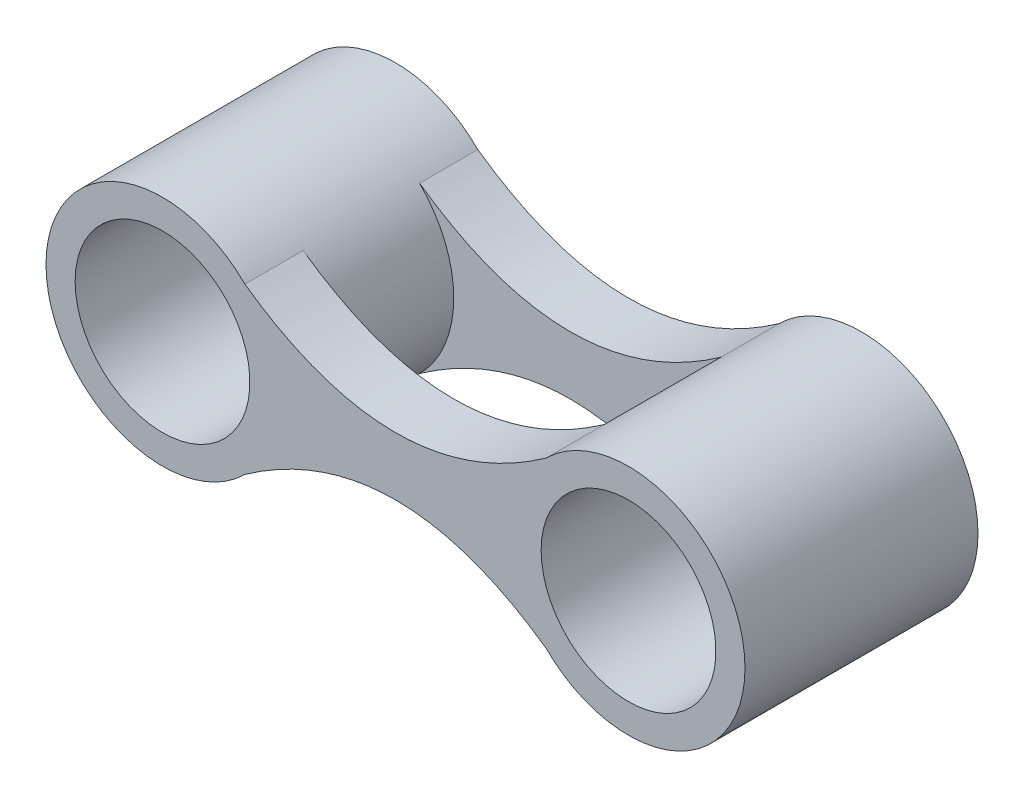
ISO-10303-21;
HEADER;
FILE_DESCRIPTION(('STEP AP214'),'2;1');
FILE_NAME('part.step','',(''),(''),'','','');
FILE_SCHEMA(('AUTOMOTIVE_DESIGN { 1 0 10303 214 1 1 1 1 }'));
ENDSEC;
DATA;
#1=APPLICATION_CONTEXT('core data for automotive mechanical design processes');
#2=APPLICATION_PROTOCOL_DEFINITION('international standard','automotive_design',2000,#1);
#3=PRODUCT_CONTEXT('',#1,'mechanical');
#4=PRODUCT('Part','Part','',(#3));
#5=PRODUCT_RELATED_PRODUCT_CATEGORY('part','',(#4));
#6=PRODUCT_DEFINITION_FORMATION('','',#4);
#7=PRODUCT_DEFINITION_CONTEXT('part definition',#1,'design');
#8=PRODUCT_DEFINITION('design','',#6,#7);
#9=PRODUCT_DEFINITION_SHAPE('','',#8);
#10=(LENGTH_UNIT() NAMED_UNIT(*) SI_UNIT(.MILLI.,.METRE.));
#11=(NAMED_UNIT(*) PLANE_ANGLE_UNIT() SI_UNIT($,.RADIAN.));
#12=(NAMED_UNIT(*) SI_UNIT($,.STERADIAN.) SOLID_ANGLE_UNIT());
#13=UNCERTAINTY_MEASURE_WITH_UNIT(LENGTH_MEASURE(1.E-05),#10,'distance_accuracy_value','');
#14=(GEOMETRIC_REPRESENTATION_CONTEXT(3) GLOBAL_UNCERTAINTY_ASSIGNED_CONTEXT((#13)) GLOBAL_UNIT_ASSIGNED_CONTEXT((#10,
#11,#12)) REPRESENTATION_CONTEXT('',''));
#15=CARTESIAN_POINT('',(0.,0.,0.));
#16=DIRECTION('',(0.,0.,1.));
#17=DIRECTION('',(1.,0.,0.));
#18=AXIS2_PLACEMENT_3D('',#15,#16,#17);
#19=CARTESIAN_POINT('',(3.07870197729953,1.68379802270047,1.984375));
#20=CARTESIAN_POINT('',(0.,-0.493173022700466,1.984375));
#21=CARTESIAN_POINT('',(-3.07870197729953,1.68379802270047,1.984375));
#22=B_SPLINE_CURVE_WITH_KNOTS('',2,(#19,#20,#21),.UNSPECIFIED.,.F.,.F.,(3,3),(0.,1.),.UNSPECIFIED.);
#23=DIRECTION('',(0.,0.,-1.));
#24=VECTOR('',#23,1.);
#25=SURFACE_OF_LINEAR_EXTRUSION('',#22,#24);
#26=CARTESIAN_POINT('',(3.07870197729953,1.68379802270047,0.79375));
#27=CARTESIAN_POINT('',(0.,-0.493173022700466,0.79375));
#28=CARTESIAN_POINT('',(-3.07870197729953,1.68379802270047,0.79375));
#29=B_SPLINE_CURVE_WITH_KNOTS('',2,(#26,#27,#28),.UNSPECIFIED.,.F.,.F.,(3,3),(0.,1.),.UNSPECIFIED.);
#30=CARTESIAN_POINT('',(3.07870197729953,1.68379802270047,0.79375));
#31=VERTEX_POINT('',#30);
#32=CARTESIAN_POINT('',(-3.07870197729953,1.68379802270047,0.79375));
#33=VERTEX_POINT('',#32);
#34=EDGE_CURVE('E107',#31,#33,#29,.T.);
#35=ORIENTED_EDGE('',*,*,#34,.T.);
#36=DIRECTION('',(0.,0.,-1.));
#37=VECTOR('',#36,1.);
#38=CARTESIAN_POINT('',(-3.07870197729953,1.68379802270047,1.984375));
#39=LINE('',#38,#37);
#40=CARTESIAN_POINT('',(-3.07870197729953,1.68379802270047,1.984375));
#41=VERTEX_POINT('',#40);
#42=EDGE_CURVE('E39',#41,#33,#39,.T.);
#43=ORIENTED_EDGE('',*,*,#42,.F.);
#44=CARTESIAN_POINT('',(3.07870197729953,1.68379802270047,1.984375));
#45=VERTEX_POINT('',#44);
#46=EDGE_CURVE('E169',#45,#41,#22,.T.);
#47=ORIENTED_EDGE('',*,*,#46,.F.);
#48=DIRECTION('',(0.,0.,-1.));
#49=VECTOR('',#48,1.);
#50=CARTESIAN_POINT('',(3.07870197729953,1.68379802270047,1.984375));
#51=LINE('',#50,#49);
#52=EDGE_CURVE('E168',#45,#31,#51,.T.);
#53=ORIENTED_EDGE('',*,*,#52,.T.);
#54=EDGE_LOOP('',(#35,#43,#47,#53));
#55=FACE_BOUND('',#54,.T.);
#56=ADVANCED_FACE('F35',(#55),#25,.F.);
#57=CARTESIAN_POINT('',(-4.7625,0.,1.984375));
#58=DIRECTION('',(0.,0.,-1.));
#59=DIRECTION('',(-1.,0.,0.));
#60=AXIS2_PLACEMENT_3D('',#57,#58,#59);
#61=CYLINDRICAL_SURFACE('',#60,2.38125);
#62=CARTESIAN_POINT('',(-4.7625,0.,0.79375));
#63=DIRECTION('',(0.,0.,1.));
#64=DIRECTION('',(1.,0.,0.));
#65=AXIS2_PLACEMENT_3D('',#62,#63,#64);
#66=CIRCLE('',#65,2.38125);
#67=CARTESIAN_POINT('',(-3.07870197729953,-1.68379802270047,0.79375));
#68=VERTEX_POINT('',#67);
#69=EDGE_CURVE('E180',#33,#68,#66,.T.);
#70=ORIENTED_EDGE('',*,*,#69,.T.);
#71=DIRECTION('',(0.,0.,-1.));
#72=VECTOR('',#71,1.);
#73=CARTESIAN_POINT('',(-3.07870197729953,-1.68379802270047,1.984375));
#74=LINE('',#73,#72);
#75=CARTESIAN_POINT('',(-3.07870197729953,-1.68379802270047,1.984375));
#76=VERTEX_POINT('',#75);
#77=EDGE_CURVE('E198',#76,#68,#74,.T.);
#78=ORIENTED_EDGE('',*,*,#77,.F.);
#79=CARTESIAN_POINT('',(-4.7625,0.,1.984375));
#80=DIRECTION('',(0.,0.,1.));
#81=DIRECTION('',(1.,0.,0.));
#82=AXIS2_PLACEMENT_3D('',#79,#80,#81);
#83=CIRCLE('',#82,2.38125);
#84=EDGE_CURVE('E11',#76,#41,#83,.T.);
#85=ORIENTED_EDGE('',*,*,#84,.T.);
#86=ORIENTED_EDGE('',*,*,#42,.T.);
#87=EDGE_LOOP('',(#70,#78,#85,#86));
#88=FACE_BOUND('',#87,.T.);
#89=CARTESIAN_POINT('',(-4.7625,0.,4.365625));
#90=DIRECTION('',(0.,0.,1.));
#91=DIRECTION('',(1.,0.,0.));
#92=AXIS2_PLACEMENT_3D('',#89,#90,#91);
#93=CIRCLE('',#92,2.38125);
#94=CARTESIAN_POINT('',(-3.07870197729953,-1.68379802270047,4.365625));
#95=VERTEX_POINT('',#94);
#96=CARTESIAN_POINT('',(-3.07870197729953,1.68379802270047,4.365625));
#97=VERTEX_POINT('',#96);
#98=EDGE_CURVE('E51',#95,#97,#93,.T.);
#99=ORIENTED_EDGE('',*,*,#98,.F.);
#100=DIRECTION('',(0.,0.,1.));
#101=VECTOR('',#100,1.);
#102=CARTESIAN_POINT('',(-3.07870197729953,-1.68379802270047,4.365625));
#103=LINE('',#102,#101);
#104=CARTESIAN_POINT('',(-3.07870197729953,-1.68379802270047,5.55625));
#105=VERTEX_POINT('',#104);
#106=EDGE_CURVE('E217',#95,#105,#103,.T.);
#107=ORIENTED_EDGE('',*,*,#106,.T.);
#108=CARTESIAN_POINT('',(-4.7625,0.,5.55625));
#109=DIRECTION('',(0.,0.,1.));
#110=DIRECTION('',(1.,0.,0.));
#111=AXIS2_PLACEMENT_3D('',#108,#109,#110);
#112=CIRCLE('',#111,2.38125);
#113=CARTESIAN_POINT('',(-3.07870197729953,1.68379802270047,5.55625));
#114=VERTEX_POINT('',#113);
#115=EDGE_CURVE('E120',#114,#105,#112,.T.);
#116=ORIENTED_EDGE('',*,*,#115,.F.);
#117=DIRECTION('',(0.,0.,1.));
#118=VECTOR('',#117,1.);
#119=CARTESIAN_POINT('',(-3.07870197729953,1.68379802270047,4.365625));
#120=LINE('',#119,#118);
#121=EDGE_CURVE('E122',#97,#114,#120,.T.);
#122=ORIENTED_EDGE('',*,*,#121,.F.);
#123=EDGE_LOOP('',(#99,#107,#116,#122));
#124=FACE_BOUND('',#123,.T.);
#125=ADVANCED_FACE('F160',(#88,#124),#61,.T.);
#126=CARTESIAN_POINT('',(-3.07870197729953,-1.68379802270047,1.984375));
#127=CARTESIAN_POINT('',(0.,0.493173022700466,1.984375));
#128=CARTESIAN_POINT('',(3.07870197729953,-1.68379802270047,1.984375));
#129=B_SPLINE_CURVE_WITH_KNOTS('',2,(#126,#127,#128),.UNSPECIFIED.,.F.,.F.,(3,3),(0.,1.),.UNSPECIFIED.);
#130=DIRECTION('',(0.,0.,-1.));
#131=VECTOR('',#130,1.);
#132=SURFACE_OF_LINEAR_EXTRUSION('',#129,#131);
#133=CARTESIAN_POINT('',(-3.07870197729953,-1.68379802270047,0.79375));
#134=CARTESIAN_POINT('',(0.,0.493173022700466,0.79375));
#135=CARTESIAN_POINT('',(3.07870197729953,-1.68379802270047,0.79375));
#136=B_SPLINE_CURVE_WITH_KNOTS('',2,(#133,#134,#135),.UNSPECIFIED.,.F.,.F.,(3,3),(0.,1.),.UNSPECIFIED.);
#137=CARTESIAN_POINT('',(3.07870197729953,-1.68379802270047,0.79375));
#138=VERTEX_POINT('',#137);
#139=EDGE_CURVE('E185',#68,#138,#136,.T.);
#140=ORIENTED_EDGE('',*,*,#139,.T.);
#141=DIRECTION('',(0.,0.,-1.));
#142=VECTOR('',#141,1.);
#143=CARTESIAN_POINT('',(3.07870197729953,-1.68379802270047,1.984375));
#144=LINE('',#143,#142);
#145=CARTESIAN_POINT('',(3.07870197729953,-1.68379802270047,1.984375));
#146=VERTEX_POINT('',#145);
#147=EDGE_CURVE('E196',#146,#138,#144,.T.);
#148=ORIENTED_EDGE('',*,*,#147,.F.);
#149=EDGE_CURVE('E162',#76,#146,#129,.T.);
#150=ORIENTED_EDGE('',*,*,#149,.F.);
#151=ORIENTED_EDGE('',*,*,#77,.T.);
#152=EDGE_LOOP('',(#140,#148,#150,#151));
#153=FACE_BOUND('',#152,.T.);
#154=ADVANCED_FACE('F156',(#153),#132,.F.);
#155=CARTESIAN_POINT('',(4.7625,0.,1.984375));
#156=DIRECTION('',(0.,0.,-1.));
#157=DIRECTION('',(-1.,0.,0.));
#158=AXIS2_PLACEMENT_3D('',#155,#156,#157);
#159=CYLINDRICAL_SURFACE('',#158,2.38125);
#160=CARTESIAN_POINT('',(4.7625,0.,0.79375));
#161=DIRECTION('',(0.,0.,1.));
#162=DIRECTION('',(1.,0.,0.));
#163=AXIS2_PLACEMENT_3D('',#160,#161,#162);
#164=CIRCLE('',#163,2.38125);
#165=EDGE_CURVE('E189',#138,#31,#164,.T.);
#166=ORIENTED_EDGE('',*,*,#165,.T.);
#167=ORIENTED_EDGE('',*,*,#52,.F.);
#168=CARTESIAN_POINT('',(4.7625,0.,1.984375));
#169=DIRECTION('',(0.,0.,1.));
#170=DIRECTION('',(1.,0.,0.));
#171=AXIS2_PLACEMENT_3D('',#168,#169,#170);
#172=CIRCLE('',#171,2.38125);
#173=EDGE_CURVE('E108',#45,#146,#172,.T.);
#174=ORIENTED_EDGE('',*,*,#173,.T.);
#175=ORIENTED_EDGE('',*,*,#147,.T.);
#176=EDGE_LOOP('',(#166,#167,#174,#175));
#177=FACE_BOUND('',#176,.T.);
#178=CARTESIAN_POINT('',(4.7625,0.,4.365625));
#179=DIRECTION('',(0.,0.,1.));
#180=DIRECTION('',(1.,0.,0.));
#181=AXIS2_PLACEMENT_3D('',#178,#179,#180);
#182=CIRCLE('',#181,2.38125);
#183=CARTESIAN_POINT('',(3.07870197729953,1.68379802270047,4.365625));
#184=VERTEX_POINT('',#183);
#185=CARTESIAN_POINT('',(3.07870197729953,-1.68379802270047,4.365625));
#186=VERTEX_POINT('',#185);
#187=EDGE_CURVE('E59',#184,#186,#182,.T.);
#188=ORIENTED_EDGE('',*,*,#187,.F.);
#189=DIRECTION('',(0.,0.,1.));
#190=VECTOR('',#189,1.);
#191=CARTESIAN_POINT('',(3.07870197729953,1.68379802270047,4.365625));
#192=LINE('',#191,#190);
#193=CARTESIAN_POINT('',(3.07870197729953,1.68379802270047,5.55625));
#194=VERTEX_POINT('',#193);
#195=EDGE_CURVE('E103',#184,#194,#192,.T.);
#196=ORIENTED_EDGE('',*,*,#195,.T.);
#197=CARTESIAN_POINT('',(4.7625,0.,5.55625));
#198=DIRECTION('',(0.,0.,1.));
#199=DIRECTION('',(1.,0.,0.));
#200=AXIS2_PLACEMENT_3D('',#197,#198,#199);
#201=CIRCLE('',#200,2.38125);
#202=CARTESIAN_POINT('',(3.07870197729953,-1.68379802270047,5.55625));
#203=VERTEX_POINT('',#202);
#204=EDGE_CURVE('E224',#203,#194,#201,.T.);
#205=ORIENTED_EDGE('',*,*,#204,.F.);
#206=DIRECTION('',(0.,0.,1.));
#207=VECTOR('',#206,1.);
#208=CARTESIAN_POINT('',(3.07870197729953,-1.68379802270047,4.365625));
#209=LINE('',#208,#207);
#210=EDGE_CURVE('E105',#186,#203,#209,.T.);
#211=ORIENTED_EDGE('',*,*,#210,.F.);
#212=EDGE_LOOP('',(#188,#196,#205,#211));
#213=FACE_BOUND('',#212,.T.);
#214=ADVANCED_FACE('F101',(#177,#213),#159,.T.);
#215=CARTESIAN_POINT('',(0.,0.5953125,1.984375));
#216=DIRECTION('',(0.,0.,-1.));
#217=DIRECTION('',(-1.,0.,0.));
#218=AXIS2_PLACEMENT_3D('',#215,#216,#217);
#219=PLANE('',#218);
#220=ORIENTED_EDGE('',*,*,#173,.F.);
#221=ORIENTED_EDGE('',*,*,#46,.T.);
#222=ORIENTED_EDGE('',*,*,#84,.F.);
#223=ORIENTED_EDGE('',*,*,#149,.T.);
#224=EDGE_LOOP('',(#220,#221,#222,#223));
#225=FACE_BOUND('',#224,.T.);
#226=ADVANCED_FACE('F146',(#225),#219,.F.);
#227=CARTESIAN_POINT('',(0.,0.5953125,0.79375));
#228=DIRECTION('',(0.,0.,-1.));
#229=DIRECTION('',(-1.,0.,0.));
#230=AXIS2_PLACEMENT_3D('',#227,#228,#229);
#231=PLANE('',#230);
#232=CARTESIAN_POINT('',(4.7625,0.,0.79375));
#233=DIRECTION('',(0.,0.,-1.));
#234=DIRECTION('',(-1.,0.,0.));
#235=AXIS2_PLACEMENT_3D('',#232,#233,#234);
#236=CIRCLE('',#235,1.7859375);
#237=CARTESIAN_POINT('',(2.9765625,0.,0.79375));
#238=VERTEX_POINT('',#237);
#239=EDGE_CURVE('E237',#238,#238,#236,.T.);
#240=ORIENTED_EDGE('',*,*,#239,.F.);
#241=EDGE_LOOP('',(#240));
#242=FACE_BOUND('',#241,.T.);
#243=CARTESIAN_POINT('',(-4.7625,0.,0.79375));
#244=DIRECTION('',(0.,0.,-1.));
#245=DIRECTION('',(-1.,0.,0.));
#246=AXIS2_PLACEMENT_3D('',#243,#244,#245);
#247=CIRCLE('',#246,1.7859375);
#248=CARTESIAN_POINT('',(-6.5484375,0.,0.79375));
#249=VERTEX_POINT('',#248);
#250=EDGE_CURVE('E131',#249,#249,#247,.T.);
#251=ORIENTED_EDGE('',*,*,#250,.F.);
#252=EDGE_LOOP('',(#251));
#253=FACE_BOUND('',#252,.T.);
#254=ORIENTED_EDGE('',*,*,#34,.F.);
#255=ORIENTED_EDGE('',*,*,#165,.F.);
#256=ORIENTED_EDGE('',*,*,#139,.F.);
#257=ORIENTED_EDGE('',*,*,#69,.F.);
#258=EDGE_LOOP('',(#254,#255,#256,#257));
#259=FACE_BOUND('',#258,.T.);
#260=ADVANCED_FACE('F149',(#242,#253,#259),#231,.T.);
#261=CARTESIAN_POINT('',(0.,0.5953125,4.365625));
#262=DIRECTION('',(0.,0.,1.));
#263=DIRECTION('',(-1.,0.,0.));
#264=AXIS2_PLACEMENT_3D('',#261,#262,#263);
#265=PLANE('',#264);
#266=CARTESIAN_POINT('',(-3.07870197729953,-1.68379802270047,4.365625));
#267=CARTESIAN_POINT('',(0.,0.493173022700466,4.365625));
#268=CARTESIAN_POINT('',(3.07870197729953,-1.68379802270047,4.365625));
#269=B_SPLINE_CURVE_WITH_KNOTS('',2,(#266,#267,#268),.UNSPECIFIED.,.F.,.F.,(3,3),(0.,1.),.UNSPECIFIED.);
#270=EDGE_CURVE('E119',#95,#186,#269,.T.);
#271=ORIENTED_EDGE('',*,*,#270,.F.);
#272=ORIENTED_EDGE('',*,*,#98,.T.);
#273=CARTESIAN_POINT('',(3.07870197729953,1.68379802270047,4.365625));
#274=CARTESIAN_POINT('',(0.,-0.493173022700466,4.365625));
#275=CARTESIAN_POINT('',(-3.07870197729953,1.68379802270047,4.365625));
#276=B_SPLINE_CURVE_WITH_KNOTS('',2,(#273,#274,#275),.UNSPECIFIED.,.F.,.F.,(3,3),(0.,1.),.UNSPECIFIED.);
#277=EDGE_CURVE('E113',#184,#97,#276,.T.);
#278=ORIENTED_EDGE('',*,*,#277,.F.);
#279=ORIENTED_EDGE('',*,*,#187,.T.);
#280=EDGE_LOOP('',(#271,#272,#278,#279));
#281=FACE_BOUND('',#280,.T.);
#282=ADVANCED_FACE('F118',(#281),#265,.F.);
#283=DIRECTION('',(0.,0.,1.));
#284=VECTOR('',#283,1.);
#285=SURFACE_OF_LINEAR_EXTRUSION('',#276,#284);
#286=CARTESIAN_POINT('',(3.07870197729953,1.68379802270047,5.55625));
#287=CARTESIAN_POINT('',(0.,-0.493173022700466,5.55625));
#288=CARTESIAN_POINT('',(-3.07870197729953,1.68379802270047,5.55625));
#289=B_SPLINE_CURVE_WITH_KNOTS('',2,(#286,#287,#288),.UNSPECIFIED.,.F.,.F.,(3,3),(0.,1.),.UNSPECIFIED.);
#290=EDGE_CURVE('E115',#194,#114,#289,.T.);
#291=ORIENTED_EDGE('',*,*,#290,.F.);
#292=ORIENTED_EDGE('',*,*,#195,.F.);
#293=ORIENTED_EDGE('',*,*,#277,.T.);
#294=ORIENTED_EDGE('',*,*,#121,.T.);
#295=EDGE_LOOP('',(#291,#292,#293,#294));
#296=FACE_BOUND('',#295,.T.);
#297=ADVANCED_FACE('F112',(#296),#285,.T.);
#298=DIRECTION('',(0.,0.,1.));
#299=VECTOR('',#298,1.);
#300=SURFACE_OF_LINEAR_EXTRUSION('',#269,#299);
#301=CARTESIAN_POINT('',(-3.07870197729953,-1.68379802270047,5.55625));
#302=CARTESIAN_POINT('',(0.,0.493173022700466,5.55625));
#303=CARTESIAN_POINT('',(3.07870197729953,-1.68379802270047,5.55625));
#304=B_SPLINE_CURVE_WITH_KNOTS('',2,(#301,#302,#303),.UNSPECIFIED.,.F.,.F.,(3,3),(0.,1.),.UNSPECIFIED.);
#305=EDGE_CURVE('E125',#105,#203,#304,.T.);
#306=ORIENTED_EDGE('',*,*,#305,.F.);
#307=ORIENTED_EDGE('',*,*,#106,.F.);
#308=ORIENTED_EDGE('',*,*,#270,.T.);
#309=ORIENTED_EDGE('',*,*,#210,.T.);
#310=EDGE_LOOP('',(#306,#307,#308,#309));
#311=FACE_BOUND('',#310,.T.);
#312=ADVANCED_FACE('F144',(#311),#300,.T.);
#313=CARTESIAN_POINT('',(0.,0.5953125,5.55625));
#314=DIRECTION('',(0.,0.,1.));
#315=DIRECTION('',(-1.,0.,0.));
#316=AXIS2_PLACEMENT_3D('',#313,#314,#315);
#317=PLANE('',#316);
#318=CARTESIAN_POINT('',(4.7625,0.,5.55625));
#319=DIRECTION('',(0.,0.,-1.));
#320=DIRECTION('',(-1.,0.,0.));
#321=AXIS2_PLACEMENT_3D('',#318,#319,#320);
#322=CIRCLE('',#321,1.7859375);
#323=CARTESIAN_POINT('',(2.9765625,0.,5.55625));
#324=VERTEX_POINT('',#323);
#325=EDGE_CURVE('E230',#324,#324,#322,.T.);
#326=ORIENTED_EDGE('',*,*,#325,.T.);
#327=EDGE_LOOP('',(#326));
#328=FACE_BOUND('',#327,.T.);
#329=CARTESIAN_POINT('',(-4.7625,0.,5.55625));
#330=DIRECTION('',(0.,0.,-1.));
#331=DIRECTION('',(-1.,0.,0.));
#332=AXIS2_PLACEMENT_3D('',#329,#330,#331);
#333=CIRCLE('',#332,1.7859375);
#334=CARTESIAN_POINT('',(-6.5484375,0.,5.55625));
#335=VERTEX_POINT('',#334);
#336=EDGE_CURVE('E242',#335,#335,#333,.T.);
#337=ORIENTED_EDGE('',*,*,#336,.T.);
#338=EDGE_LOOP('',(#337));
#339=FACE_BOUND('',#338,.T.);
#340=ORIENTED_EDGE('',*,*,#290,.T.);
#341=ORIENTED_EDGE('',*,*,#115,.T.);
#342=ORIENTED_EDGE('',*,*,#305,.T.);
#343=ORIENTED_EDGE('',*,*,#204,.T.);
#344=EDGE_LOOP('',(#340,#341,#342,#343));
#345=FACE_BOUND('',#344,.T.);
#346=ADVANCED_FACE('F254',(#328,#339,#345),#317,.T.);
#347=CARTESIAN_POINT('',(-4.7625,0.,5.55625));
#348=DIRECTION('',(0.,0.,-1.));
#349=DIRECTION('',(-1.,0.,0.));
#350=AXIS2_PLACEMENT_3D('',#347,#348,#349);
#351=CYLINDRICAL_SURFACE('',#350,1.7859375);
#352=ORIENTED_EDGE('',*,*,#336,.F.);
#353=EDGE_LOOP('',(#352));
#354=FACE_BOUND('',#353,.T.);
#355=ORIENTED_EDGE('',*,*,#250,.T.);
#356=EDGE_LOOP('',(#355));
#357=FACE_BOUND('',#356,.T.);
#358=ADVANCED_FACE('F250',(#354,#357),#351,.F.);
#359=CARTESIAN_POINT('',(4.7625,0.,5.55625));
#360=DIRECTION('',(0.,0.,-1.));
#361=DIRECTION('',(-1.,0.,0.));
#362=AXIS2_PLACEMENT_3D('',#359,#360,#361);
#363=CYLINDRICAL_SURFACE('',#362,1.7859375);
#364=ORIENTED_EDGE('',*,*,#325,.F.);
#365=EDGE_LOOP('',(#364));
#366=FACE_BOUND('',#365,.T.);
#367=ORIENTED_EDGE('',*,*,#239,.T.);
#368=EDGE_LOOP('',(#367));
#369=FACE_BOUND('',#368,.T.);
#370=ADVANCED_FACE('F253',(#366,#369),#363,.F.);
#371=CLOSED_SHELL('',(#56,#125,#154,#214,#226,#260,#282,#297,#312,#346,#358,#370));
#372=MANIFOLD_SOLID_BREP('B2',#371);
#373=ADVANCED_BREP_SHAPE_REPRESENTATION('',(#18,#372),#14);
#374=SHAPE_DEFINITION_REPRESENTATION(#9,#373);
ENDSEC;
END-ISO-10303-21;
